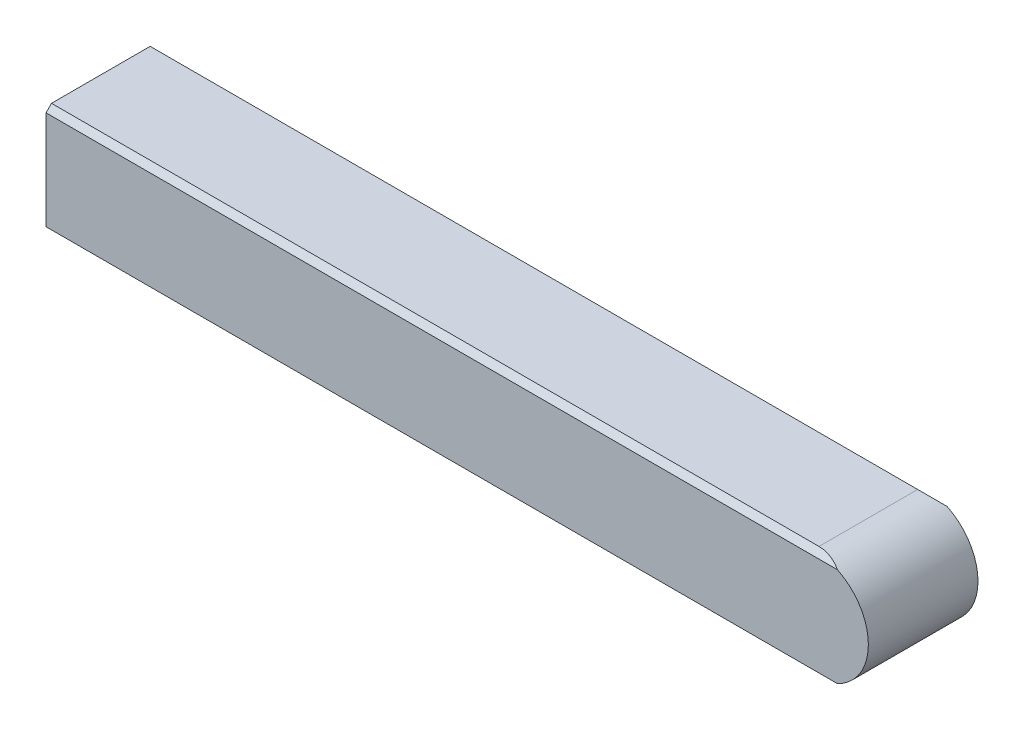
ISO-10303-21;
HEADER;
FILE_DESCRIPTION(('STEP AP214'),'2;1');
FILE_NAME('part.step','',(''),(''),'','','');
FILE_SCHEMA(('AUTOMOTIVE_DESIGN { 1 0 10303 214 1 1 1 1 }'));
ENDSEC;
DATA;
#1=APPLICATION_CONTEXT('core data for automotive mechanical design processes');
#2=APPLICATION_PROTOCOL_DEFINITION('international standard','automotive_design',2000,#1);
#3=PRODUCT_CONTEXT('',#1,'mechanical');
#4=PRODUCT('Part','Part','',(#3));
#5=PRODUCT_RELATED_PRODUCT_CATEGORY('part','',(#4));
#6=PRODUCT_DEFINITION_FORMATION('','',#4);
#7=PRODUCT_DEFINITION_CONTEXT('part definition',#1,'design');
#8=PRODUCT_DEFINITION('design','',#6,#7);
#9=PRODUCT_DEFINITION_SHAPE('','',#8);
#10=(LENGTH_UNIT() NAMED_UNIT(*) SI_UNIT(.MILLI.,.METRE.));
#11=(NAMED_UNIT(*) PLANE_ANGLE_UNIT() SI_UNIT($,.RADIAN.));
#12=(NAMED_UNIT(*) SI_UNIT($,.STERADIAN.) SOLID_ANGLE_UNIT());
#13=UNCERTAINTY_MEASURE_WITH_UNIT(LENGTH_MEASURE(1.E-05),#10,'distance_accuracy_value','');
#14=(GEOMETRIC_REPRESENTATION_CONTEXT(3) GLOBAL_UNCERTAINTY_ASSIGNED_CONTEXT((#13)) GLOBAL_UNIT_ASSIGNED_CONTEXT((#10,
#11,#12)) REPRESENTATION_CONTEXT('',''));
#15=CARTESIAN_POINT('',(0.,0.,0.));
#16=DIRECTION('',(0.,0.,1.));
#17=DIRECTION('',(1.,0.,0.));
#18=AXIS2_PLACEMENT_3D('',#15,#16,#17);
#19=CARTESIAN_POINT('',(0.,0.2,4.));
#20=DIRECTION('',(0.,0.707106781186548,-0.707106781186548));
#21=DIRECTION('',(0.,0.707106781186548,0.707106781186548));
#22=AXIS2_PLACEMENT_3D('',#19,#20,#21);
#23=PLANE('',#22);
#24=DIRECTION('',(1.,0.,0.));
#25=VECTOR('',#24,1.);
#26=CARTESIAN_POINT('',(0.,0.2,4.));
#27=LINE('',#26,#25);
#28=CARTESIAN_POINT('',(0.,0.2,4.));
#29=VERTEX_POINT('',#28);
#30=CARTESIAN_POINT('',(28.8717797887081,0.2,4.));
#31=VERTEX_POINT('',#30);
#32=EDGE_CURVE('E79',#29,#31,#27,.T.);
#33=ORIENTED_EDGE('',*,*,#32,.F.);
#34=DIRECTION('',(0.,0.707106781186548,0.707106781186548));
#35=VECTOR('',#34,1.);
#36=CARTESIAN_POINT('',(0.,0.2,4.));
#37=LINE('',#36,#35);
#38=CARTESIAN_POINT('',(0.,0.,3.8));
#39=VERTEX_POINT('',#38);
#40=EDGE_CURVE('E70',#39,#29,#37,.T.);
#41=ORIENTED_EDGE('',*,*,#40,.F.);
#42=DIRECTION('',(1.,0.,0.));
#43=VECTOR('',#42,1.);
#44=CARTESIAN_POINT('',(28.,0.,3.8));
#45=LINE('',#44,#43);
#46=CARTESIAN_POINT('',(28.,0.,3.8));
#47=VERTEX_POINT('',#46);
#48=EDGE_CURVE('E73',#47,#39,#45,.F.);
#49=ORIENTED_EDGE('',*,*,#48,.F.);
#50=CARTESIAN_POINT('',(28.,2.,5.8));
#51=DIRECTION('',(0.,0.707106781186548,-0.707106781186548));
#52=DIRECTION('',(0.,-0.707106781186548,-0.707106781186548));
#53=AXIS2_PLACEMENT_3D('',#50,#51,#52);
#54=ELLIPSE('',#53,2.82842712474619,2.);
#55=EDGE_CURVE('E19',#31,#47,#54,.T.);
#56=ORIENTED_EDGE('',*,*,#55,.F.);
#57=EDGE_LOOP('',(#33,#41,#49,#56));
#58=FACE_BOUND('',#57,.T.);
#59=ADVANCED_FACE('F16',(#58),#23,.F.);
#60=CARTESIAN_POINT('',(0.,4.,3.8));
#61=DIRECTION('',(0.,-0.707106781186548,-0.707106781186548));
#62=DIRECTION('',(0.,0.707106781186548,-0.707106781186548));
#63=AXIS2_PLACEMENT_3D('',#60,#61,#62);
#64=PLANE('',#63);
#65=DIRECTION('',(1.,0.,0.));
#66=VECTOR('',#65,1.);
#67=CARTESIAN_POINT('',(0.,4.,3.8));
#68=LINE('',#67,#66);
#69=CARTESIAN_POINT('',(0.,4.,3.8));
#70=VERTEX_POINT('',#69);
#71=CARTESIAN_POINT('',(28.,4.,3.8));
#72=VERTEX_POINT('',#71);
#73=EDGE_CURVE('E78',#70,#72,#68,.T.);
#74=ORIENTED_EDGE('',*,*,#73,.F.);
#75=DIRECTION('',(0.,0.707106781186548,-0.707106781186548));
#76=VECTOR('',#75,1.);
#77=CARTESIAN_POINT('',(0.,4.,3.8));
#78=LINE('',#77,#76);
#79=CARTESIAN_POINT('',(0.,3.8,4.));
#80=VERTEX_POINT('',#79);
#81=EDGE_CURVE('E69',#80,#70,#78,.T.);
#82=ORIENTED_EDGE('',*,*,#81,.F.);
#83=DIRECTION('',(1.,0.,0.));
#84=VECTOR('',#83,1.);
#85=CARTESIAN_POINT('',(0.,3.8,4.));
#86=LINE('',#85,#84);
#87=CARTESIAN_POINT('',(28.8717797887081,3.8,4.));
#88=VERTEX_POINT('',#87);
#89=EDGE_CURVE('E114',#88,#80,#86,.F.);
#90=ORIENTED_EDGE('',*,*,#89,.F.);
#91=CARTESIAN_POINT('',(28.,2.,5.8));
#92=DIRECTION('',(0.,-0.707106781186548,-0.707106781186548));
#93=DIRECTION('',(0.,0.707106781186548,-0.707106781186548));
#94=AXIS2_PLACEMENT_3D('',#91,#92,#93);
#95=ELLIPSE('',#94,2.82842712474619,2.);
#96=EDGE_CURVE('E119',#72,#88,#95,.T.);
#97=ORIENTED_EDGE('',*,*,#96,.F.);
#98=EDGE_LOOP('',(#74,#82,#90,#97));
#99=FACE_BOUND('',#98,.T.);
#100=ADVANCED_FACE('F151',(#99),#64,.F.);
#101=CARTESIAN_POINT('',(0.,0.,4.));
#102=DIRECTION('',(0.,0.,1.));
#103=DIRECTION('',(1.,0.,0.));
#104=AXIS2_PLACEMENT_3D('',#101,#102,#103);
#105=PLANE('',#104);
#106=ORIENTED_EDGE('',*,*,#32,.T.);
#107=CARTESIAN_POINT('',(28.,2.,4.));
#108=DIRECTION('',(0.,0.,-1.));
#109=DIRECTION('',(-1.,0.,0.));
#110=AXIS2_PLACEMENT_3D('',#107,#108,#109);
#111=CIRCLE('',#110,2.);
#112=EDGE_CURVE('E68',#88,#31,#111,.T.);
#113=ORIENTED_EDGE('',*,*,#112,.F.);
#114=ORIENTED_EDGE('',*,*,#89,.T.);
#115=DIRECTION('',(0.,1.,0.));
#116=VECTOR('',#115,1.);
#117=CARTESIAN_POINT('',(0.,0.,4.));
#118=LINE('',#117,#116);
#119=EDGE_CURVE('E108',#29,#80,#118,.T.);
#120=ORIENTED_EDGE('',*,*,#119,.F.);
#121=EDGE_LOOP('',(#106,#113,#114,#120));
#122=FACE_BOUND('',#121,.T.);
#123=ADVANCED_FACE('F155',(#122),#105,.T.);
#124=CARTESIAN_POINT('',(28.,0.,0.));
#125=DIRECTION('',(0.,-1.,0.));
#126=DIRECTION('',(0.,0.,-1.));
#127=AXIS2_PLACEMENT_3D('',#124,#125,#126);
#128=PLANE('',#127);
#129=ORIENTED_EDGE('',*,*,#48,.T.);
#130=DIRECTION('',(0.,0.,1.));
#131=VECTOR('',#130,1.);
#132=CARTESIAN_POINT('',(0.,0.,0.));
#133=LINE('',#132,#131);
#134=CARTESIAN_POINT('',(0.,0.,0.2));
#135=VERTEX_POINT('',#134);
#136=EDGE_CURVE('E124',#135,#39,#133,.T.);
#137=ORIENTED_EDGE('',*,*,#136,.F.);
#138=DIRECTION('',(1.,0.,0.));
#139=VECTOR('',#138,1.);
#140=CARTESIAN_POINT('',(0.,0.,0.2));
#141=LINE('',#140,#139);
#142=CARTESIAN_POINT('',(28.,0.,0.2));
#143=VERTEX_POINT('',#142);
#144=EDGE_CURVE('E83',#135,#143,#141,.T.);
#145=ORIENTED_EDGE('',*,*,#144,.T.);
#146=DIRECTION('',(0.,0.,-1.));
#147=VECTOR('',#146,1.);
#148=CARTESIAN_POINT('',(28.,0.,0.));
#149=LINE('',#148,#147);
#150=EDGE_CURVE('E65',#47,#143,#149,.T.);
#151=ORIENTED_EDGE('',*,*,#150,.F.);
#152=EDGE_LOOP('',(#129,#137,#145,#151));
#153=FACE_BOUND('',#152,.T.);
#154=ADVANCED_FACE('F81',(#153),#128,.T.);
#155=CARTESIAN_POINT('',(0.,4.,0.));
#156=DIRECTION('',(0.,1.,0.));
#157=DIRECTION('',(0.,0.,1.));
#158=AXIS2_PLACEMENT_3D('',#155,#156,#157);
#159=PLANE('',#158);
#160=ORIENTED_EDGE('',*,*,#73,.T.);
#161=DIRECTION('',(0.,0.,-1.));
#162=VECTOR('',#161,1.);
#163=CARTESIAN_POINT('',(28.,4.,0.));
#164=LINE('',#163,#162);
#165=CARTESIAN_POINT('',(28.,4.,0.2));
#166=VERTEX_POINT('',#165);
#167=EDGE_CURVE('E89',#166,#72,#164,.F.);
#168=ORIENTED_EDGE('',*,*,#167,.F.);
#169=DIRECTION('',(1.,0.,0.));
#170=VECTOR('',#169,1.);
#171=CARTESIAN_POINT('',(0.,4.,0.2));
#172=LINE('',#171,#170);
#173=CARTESIAN_POINT('',(0.,4.,0.2));
#174=VERTEX_POINT('',#173);
#175=EDGE_CURVE('E87',#166,#174,#172,.F.);
#176=ORIENTED_EDGE('',*,*,#175,.T.);
#177=DIRECTION('',(0.,0.,1.));
#178=VECTOR('',#177,1.);
#179=CARTESIAN_POINT('',(0.,4.,0.));
#180=LINE('',#179,#178);
#181=EDGE_CURVE('E103',#70,#174,#180,.F.);
#182=ORIENTED_EDGE('',*,*,#181,.F.);
#183=EDGE_LOOP('',(#160,#168,#176,#182));
#184=FACE_BOUND('',#183,.T.);
#185=ADVANCED_FACE('F197',(#184),#159,.T.);
#186=CARTESIAN_POINT('',(0.,0.,0.));
#187=DIRECTION('',(-1.,0.,0.));
#188=DIRECTION('',(0.,0.,1.));
#189=AXIS2_PLACEMENT_3D('',#186,#187,#188);
#190=PLANE('',#189);
#191=ORIENTED_EDGE('',*,*,#81,.T.);
#192=ORIENTED_EDGE('',*,*,#181,.T.);
#193=DIRECTION('',(0.,-0.707106781186548,-0.707106781186547));
#194=VECTOR('',#193,1.);
#195=CARTESIAN_POINT('',(0.,3.8,0.));
#196=LINE('',#195,#194);
#197=CARTESIAN_POINT('',(0.,3.8,0.));
#198=VERTEX_POINT('',#197);
#199=EDGE_CURVE('E145',#174,#198,#196,.T.);
#200=ORIENTED_EDGE('',*,*,#199,.T.);
#201=DIRECTION('',(0.,1.,0.));
#202=VECTOR('',#201,1.);
#203=CARTESIAN_POINT('',(0.,0.,0.));
#204=LINE('',#203,#202);
#205=CARTESIAN_POINT('',(0.,0.2,0.));
#206=VERTEX_POINT('',#205);
#207=EDGE_CURVE('E144',#198,#206,#204,.F.);
#208=ORIENTED_EDGE('',*,*,#207,.T.);
#209=DIRECTION('',(0.,-0.707106781186547,0.707106781186548));
#210=VECTOR('',#209,1.);
#211=CARTESIAN_POINT('',(0.,0.,0.2));
#212=LINE('',#211,#210);
#213=EDGE_CURVE('E98',#206,#135,#212,.T.);
#214=ORIENTED_EDGE('',*,*,#213,.T.);
#215=ORIENTED_EDGE('',*,*,#136,.T.);
#216=ORIENTED_EDGE('',*,*,#40,.T.);
#217=ORIENTED_EDGE('',*,*,#119,.T.);
#218=EDGE_LOOP('',(#191,#192,#200,#208,#214,#215,#216,#217));
#219=FACE_BOUND('',#218,.T.);
#220=ADVANCED_FACE('F176',(#219),#190,.T.);
#221=CARTESIAN_POINT('',(0.,0.,0.2));
#222=DIRECTION('',(0.,0.707106781186548,0.707106781186547));
#223=DIRECTION('',(0.,-0.707106781186547,0.707106781186548));
#224=AXIS2_PLACEMENT_3D('',#221,#222,#223);
#225=PLANE('',#224);
#226=ORIENTED_EDGE('',*,*,#144,.F.);
#227=ORIENTED_EDGE('',*,*,#213,.F.);
#228=DIRECTION('',(1.,0.,0.));
#229=VECTOR('',#228,1.);
#230=CARTESIAN_POINT('',(0.,0.2,0.));
#231=LINE('',#230,#229);
#232=CARTESIAN_POINT('',(28.8717797887081,0.2,0.));
#233=VERTEX_POINT('',#232);
#234=EDGE_CURVE('E143',#206,#233,#231,.T.);
#235=ORIENTED_EDGE('',*,*,#234,.T.);
#236=CARTESIAN_POINT('',(28.,2.,-1.8));
#237=DIRECTION('',(0.,0.707106781186548,0.707106781186547));
#238=DIRECTION('',(0.,0.707106781186547,-0.707106781186548));
#239=AXIS2_PLACEMENT_3D('',#236,#237,#238);
#240=ELLIPSE('',#239,2.82842712474619,2.);
#241=EDGE_CURVE('E85',#143,#233,#240,.T.);
#242=ORIENTED_EDGE('',*,*,#241,.F.);
#243=EDGE_LOOP('',(#226,#227,#235,#242));
#244=FACE_BOUND('',#243,.T.);
#245=ADVANCED_FACE('F189',(#244),#225,.F.);
#246=CARTESIAN_POINT('',(28.,2.,0.));
#247=DIRECTION('',(0.,0.,-1.));
#248=DIRECTION('',(-1.,0.,0.));
#249=AXIS2_PLACEMENT_3D('',#246,#247,#248);
#250=CYLINDRICAL_SURFACE('',#249,2.);
#251=ORIENTED_EDGE('',*,*,#241,.T.);
#252=CARTESIAN_POINT('',(28.,2.,0.));
#253=DIRECTION('',(0.,0.,-1.));
#254=DIRECTION('',(-1.,0.,0.));
#255=AXIS2_PLACEMENT_3D('',#252,#253,#254);
#256=CIRCLE('',#255,2.);
#257=CARTESIAN_POINT('',(28.8717797887081,3.8,0.));
#258=VERTEX_POINT('',#257);
#259=EDGE_CURVE('E25',#233,#258,#256,.F.);
#260=ORIENTED_EDGE('',*,*,#259,.T.);
#261=CARTESIAN_POINT('',(28.,2.,-1.8));
#262=DIRECTION('',(0.,-0.707106781186547,0.707106781186548));
#263=DIRECTION('',(0.,-0.707106781186548,-0.707106781186547));
#264=AXIS2_PLACEMENT_3D('',#261,#262,#263);
#265=ELLIPSE('',#264,2.82842712474619,2.);
#266=EDGE_CURVE('E33',#258,#166,#265,.T.);
#267=ORIENTED_EDGE('',*,*,#266,.T.);
#268=ORIENTED_EDGE('',*,*,#167,.T.);
#269=ORIENTED_EDGE('',*,*,#96,.T.);
#270=ORIENTED_EDGE('',*,*,#112,.T.);
#271=ORIENTED_EDGE('',*,*,#55,.T.);
#272=ORIENTED_EDGE('',*,*,#150,.T.);
#273=EDGE_LOOP('',(#251,#260,#267,#268,#269,#270,#271,#272));
#274=FACE_BOUND('',#273,.T.);
#275=ADVANCED_FACE('F63',(#274),#250,.T.);
#276=CARTESIAN_POINT('',(0.,3.8,0.));
#277=DIRECTION('',(0.,-0.707106781186547,0.707106781186548));
#278=DIRECTION('',(0.,-0.707106781186548,-0.707106781186547));
#279=AXIS2_PLACEMENT_3D('',#276,#277,#278);
#280=PLANE('',#279);
#281=DIRECTION('',(1.,0.,0.));
#282=VECTOR('',#281,1.);
#283=CARTESIAN_POINT('',(0.,3.8,0.));
#284=LINE('',#283,#282);
#285=EDGE_CURVE('E11',#258,#198,#284,.F.);
#286=ORIENTED_EDGE('',*,*,#285,.T.);
#287=ORIENTED_EDGE('',*,*,#199,.F.);
#288=ORIENTED_EDGE('',*,*,#175,.F.);
#289=ORIENTED_EDGE('',*,*,#266,.F.);
#290=EDGE_LOOP('',(#286,#287,#288,#289));
#291=FACE_BOUND('',#290,.T.);
#292=ADVANCED_FACE('F180',(#291),#280,.F.);
#293=CARTESIAN_POINT('',(0.,0.,0.));
#294=DIRECTION('',(0.,0.,1.));
#295=DIRECTION('',(1.,0.,0.));
#296=AXIS2_PLACEMENT_3D('',#293,#294,#295);
#297=PLANE('',#296);
#298=ORIENTED_EDGE('',*,*,#259,.F.);
#299=ORIENTED_EDGE('',*,*,#234,.F.);
#300=ORIENTED_EDGE('',*,*,#207,.F.);
#301=ORIENTED_EDGE('',*,*,#285,.F.);
#302=EDGE_LOOP('',(#298,#299,#300,#301));
#303=FACE_BOUND('',#302,.T.);
#304=ADVANCED_FACE('F173',(#303),#297,.F.);
#305=CLOSED_SHELL('',(#59,#100,#123,#154,#185,#220,#245,#275,#292,#304));
#306=MANIFOLD_SOLID_BREP('B1',#305);
#307=ADVANCED_BREP_SHAPE_REPRESENTATION('',(#18,#306),#14);
#308=SHAPE_DEFINITION_REPRESENTATION(#9,#307);
ENDSEC;
END-ISO-10303-21;
